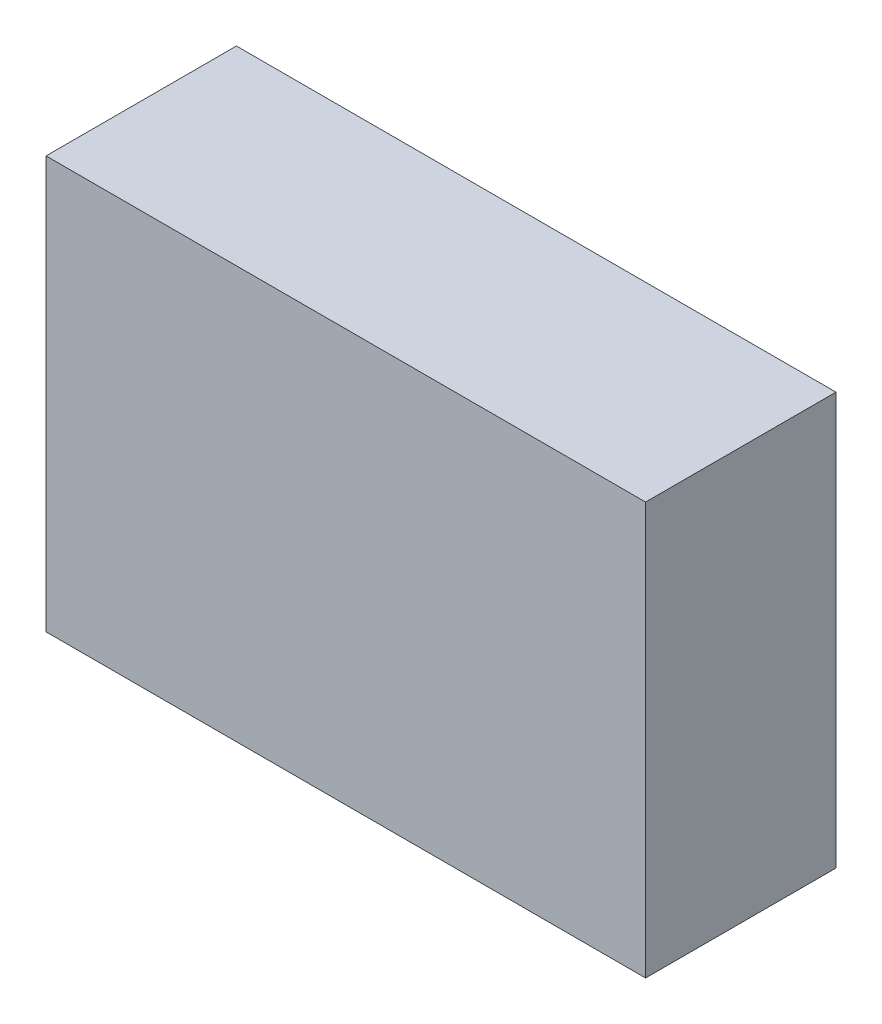
ISO-10303-21;
HEADER;
FILE_DESCRIPTION(('STEP AP214'),'2;1');
FILE_NAME('part.step','',(''),(''),'','','');
FILE_SCHEMA(('AUTOMOTIVE_DESIGN { 1 0 10303 214 1 1 1 1 }'));
ENDSEC;
DATA;
#1=APPLICATION_CONTEXT('core data for automotive mechanical design processes');
#2=APPLICATION_PROTOCOL_DEFINITION('international standard','automotive_design',2000,#1);
#3=PRODUCT_CONTEXT('',#1,'mechanical');
#4=PRODUCT('Part','Part','',(#3));
#5=PRODUCT_RELATED_PRODUCT_CATEGORY('part','',(#4));
#6=PRODUCT_DEFINITION_FORMATION('','',#4);
#7=PRODUCT_DEFINITION_CONTEXT('part definition',#1,'design');
#8=PRODUCT_DEFINITION('design','',#6,#7);
#9=PRODUCT_DEFINITION_SHAPE('','',#8);
#10=(LENGTH_UNIT() NAMED_UNIT(*) SI_UNIT(.MILLI.,.METRE.));
#11=(NAMED_UNIT(*) PLANE_ANGLE_UNIT() SI_UNIT($,.RADIAN.));
#12=(NAMED_UNIT(*) SI_UNIT($,.STERADIAN.) SOLID_ANGLE_UNIT());
#13=UNCERTAINTY_MEASURE_WITH_UNIT(LENGTH_MEASURE(1.E-05),#10,'distance_accuracy_value','');
#14=(GEOMETRIC_REPRESENTATION_CONTEXT(3) GLOBAL_UNCERTAINTY_ASSIGNED_CONTEXT((#13)) GLOBAL_UNIT_ASSIGNED_CONTEXT((#10,
#11,#12)) REPRESENTATION_CONTEXT('',''));
#15=CARTESIAN_POINT('',(0.,0.,0.));
#16=DIRECTION('',(0.,0.,1.));
#17=DIRECTION('',(1.,0.,0.));
#18=AXIS2_PLACEMENT_3D('',#15,#16,#17);
#19=CARTESIAN_POINT('',(0.,0.,0.508));
#20=DIRECTION('',(0.,0.,1.));
#21=DIRECTION('',(1.,0.,0.));
#22=AXIS2_PLACEMENT_3D('',#19,#20,#21);
#23=PLANE('',#22);
#24=DIRECTION('',(0.,-1.,0.));
#25=VECTOR('',#24,1.);
#26=CARTESIAN_POINT('',(0.80000094,0.5499989,0.5079999996327));
#27=LINE('',#26,#25);
#28=CARTESIAN_POINT('',(0.80000094,0.5499989,0.5079999996327));
#29=VERTEX_POINT('',#28);
#30=CARTESIAN_POINT('',(0.80000094,-0.5499989,0.5079999996327));
#31=VERTEX_POINT('',#30);
#32=EDGE_CURVE('E11',#29,#31,#27,.T.);
#33=ORIENTED_EDGE('',*,*,#32,.F.);
#34=DIRECTION('',(1.,0.,0.));
#35=VECTOR('',#34,1.);
#36=CARTESIAN_POINT('',(-0.8000009402997,0.5499989,0.5079999996327));
#37=LINE('',#36,#35);
#38=CARTESIAN_POINT('',(-0.8000009402997,0.5499989,0.5079999996327));
#39=VERTEX_POINT('',#38);
#40=EDGE_CURVE('E112',#39,#29,#37,.T.);
#41=ORIENTED_EDGE('',*,*,#40,.F.);
#42=DIRECTION('',(-2.724247492566E-10,1.,0.));
#43=VECTOR('',#42,1.);
#44=CARTESIAN_POINT('',(-0.80000094,-0.5499989,0.5079999996327));
#45=LINE('',#44,#43);
#46=CARTESIAN_POINT('',(-0.80000094,-0.5499989,0.5079999996327));
#47=VERTEX_POINT('',#46);
#48=EDGE_CURVE('E94',#47,#39,#45,.T.);
#49=ORIENTED_EDGE('',*,*,#48,.F.);
#50=DIRECTION('',(-1.,0.,0.));
#51=VECTOR('',#50,1.);
#52=CARTESIAN_POINT('',(0.80000094,-0.5499989,0.5079999996327));
#53=LINE('',#52,#51);
#54=EDGE_CURVE('E70',#31,#47,#53,.T.);
#55=ORIENTED_EDGE('',*,*,#54,.F.);
#56=EDGE_LOOP('',(#33,#41,#49,#55));
#57=FACE_BOUND('',#56,.T.);
#58=ADVANCED_FACE('F18',(#57),#23,.T.);
#59=CARTESIAN_POINT('',(0.80000094,-0.5499989,0.));
#60=DIRECTION('',(1.,0.,0.));
#61=DIRECTION('',(0.,1.,0.));
#62=AXIS2_PLACEMENT_3D('',#59,#60,#61);
#63=PLANE('',#62);
#64=ORIENTED_EDGE('',*,*,#32,.T.);
#65=DIRECTION('',(-3.162730359861E-10,5.118084437655E-11,-1.));
#66=VECTOR('',#65,1.);
#67=CARTESIAN_POINT('',(0.80000094,-0.5499989,0.5079999996327));
#68=LINE('',#67,#66);
#69=CARTESIAN_POINT('',(0.8000009398393,-0.549998899974,0.));
#70=VERTEX_POINT('',#69);
#71=EDGE_CURVE('E28',#31,#70,#68,.T.);
#72=ORIENTED_EDGE('',*,*,#71,.T.);
#73=DIRECTION('',(0.,-1.,0.));
#74=VECTOR('',#73,1.);
#75=CARTESIAN_POINT('',(0.8000009398393,0.549998899974,0.));
#76=LINE('',#75,#74);
#77=CARTESIAN_POINT('',(0.8000009398393,0.549998899974,0.));
#78=VERTEX_POINT('',#77);
#79=EDGE_CURVE('E66',#78,#70,#76,.T.);
#80=ORIENTED_EDGE('',*,*,#79,.F.);
#81=DIRECTION('',(-3.162730359861E-10,-5.118084437655E-11,-1.));
#82=VECTOR('',#81,1.);
#83=CARTESIAN_POINT('',(0.80000094,0.5499989,0.5079999996327));
#84=LINE('',#83,#82);
#85=EDGE_CURVE('E107',#29,#78,#84,.T.);
#86=ORIENTED_EDGE('',*,*,#85,.F.);
#87=EDGE_LOOP('',(#64,#72,#80,#86));
#88=FACE_BOUND('',#87,.T.);
#89=ADVANCED_FACE('F64',(#88),#63,.T.);
#90=CARTESIAN_POINT('',(-0.80000094,-0.5499989,0.));
#91=DIRECTION('',(0.,-1.,0.));
#92=DIRECTION('',(0.,0.,-1.));
#93=AXIS2_PLACEMENT_3D('',#90,#91,#92);
#94=PLANE('',#93);
#95=ORIENTED_EDGE('',*,*,#54,.T.);
#96=DIRECTION('',(3.162730359861E-10,5.118084437655E-11,-1.));
#97=VECTOR('',#96,1.);
#98=CARTESIAN_POINT('',(-0.80000094,-0.5499989,0.5079999996327));
#99=LINE('',#98,#97);
#100=CARTESIAN_POINT('',(-0.8000009398393,-0.549998899974,0.));
#101=VERTEX_POINT('',#100);
#102=EDGE_CURVE('E76',#47,#101,#99,.T.);
#103=ORIENTED_EDGE('',*,*,#102,.T.);
#104=DIRECTION('',(-1.,0.,0.));
#105=VECTOR('',#104,1.);
#106=CARTESIAN_POINT('',(0.8000009398393,-0.549998899974,0.));
#107=LINE('',#106,#105);
#108=EDGE_CURVE('E73',#70,#101,#107,.T.);
#109=ORIENTED_EDGE('',*,*,#108,.F.);
#110=ORIENTED_EDGE('',*,*,#71,.F.);
#111=EDGE_LOOP('',(#95,#103,#109,#110));
#112=FACE_BOUND('',#111,.T.);
#113=ADVANCED_FACE('F74',(#112),#94,.T.);
#114=CARTESIAN_POINT('',(-0.80000094,0.5499989,0.));
#115=DIRECTION('',(-1.,0.,0.));
#116=DIRECTION('',(0.,0.,1.));
#117=AXIS2_PLACEMENT_3D('',#114,#115,#116);
#118=PLANE('',#117);
#119=ORIENTED_EDGE('',*,*,#48,.T.);
#120=DIRECTION('',(3.162730359861E-10,-5.118084437655E-11,-1.));
#121=VECTOR('',#120,1.);
#122=CARTESIAN_POINT('',(-0.8000009402997,0.5499989,0.5079999996327));
#123=LINE('',#122,#121);
#124=CARTESIAN_POINT('',(-0.800000940139,0.549998899974,0.));
#125=VERTEX_POINT('',#124);
#126=EDGE_CURVE('E100',#39,#125,#123,.T.);
#127=ORIENTED_EDGE('',*,*,#126,.T.);
#128=DIRECTION('',(-2.724246483399E-10,1.,0.));
#129=VECTOR('',#128,1.);
#130=CARTESIAN_POINT('',(-0.8000009398393,-0.549998899974,0.));
#131=LINE('',#130,#129);
#132=EDGE_CURVE('E81',#101,#125,#131,.T.);
#133=ORIENTED_EDGE('',*,*,#132,.F.);
#134=ORIENTED_EDGE('',*,*,#102,.F.);
#135=EDGE_LOOP('',(#119,#127,#133,#134));
#136=FACE_BOUND('',#135,.T.);
#137=ADVANCED_FACE('F123',(#136),#118,.T.);
#138=CARTESIAN_POINT('',(0.80000094,0.5499989,0.));
#139=DIRECTION('',(0.,1.,0.));
#140=DIRECTION('',(1.,0.,0.));
#141=AXIS2_PLACEMENT_3D('',#138,#139,#140);
#142=PLANE('',#141);
#143=ORIENTED_EDGE('',*,*,#40,.T.);
#144=ORIENTED_EDGE('',*,*,#85,.T.);
#145=DIRECTION('',(1.,0.,0.));
#146=VECTOR('',#145,1.);
#147=CARTESIAN_POINT('',(-0.800000940139,0.549998899974,0.));
#148=LINE('',#147,#146);
#149=EDGE_CURVE('E85',#125,#78,#148,.T.);
#150=ORIENTED_EDGE('',*,*,#149,.F.);
#151=ORIENTED_EDGE('',*,*,#126,.F.);
#152=EDGE_LOOP('',(#143,#144,#150,#151));
#153=FACE_BOUND('',#152,.T.);
#154=ADVANCED_FACE('F127',(#153),#142,.T.);
#155=CARTESIAN_POINT('',(0.,0.,0.));
#156=DIRECTION('',(0.,0.,1.));
#157=DIRECTION('',(1.,0.,0.));
#158=AXIS2_PLACEMENT_3D('',#155,#156,#157);
#159=PLANE('',#158);
#160=ORIENTED_EDGE('',*,*,#79,.T.);
#161=ORIENTED_EDGE('',*,*,#108,.T.);
#162=ORIENTED_EDGE('',*,*,#132,.T.);
#163=ORIENTED_EDGE('',*,*,#149,.T.);
#164=EDGE_LOOP('',(#160,#161,#162,#163));
#165=FACE_BOUND('',#164,.T.);
#166=ADVANCED_FACE('F20',(#165),#159,.F.);
#167=CLOSED_SHELL('',(#58,#89,#113,#137,#154,#166));
#168=MANIFOLD_SOLID_BREP('B1',#167);
#169=ADVANCED_BREP_SHAPE_REPRESENTATION('',(#18,#168),#14);
#170=SHAPE_DEFINITION_REPRESENTATION(#9,#169);
ENDSEC;
END-ISO-10303-21;
